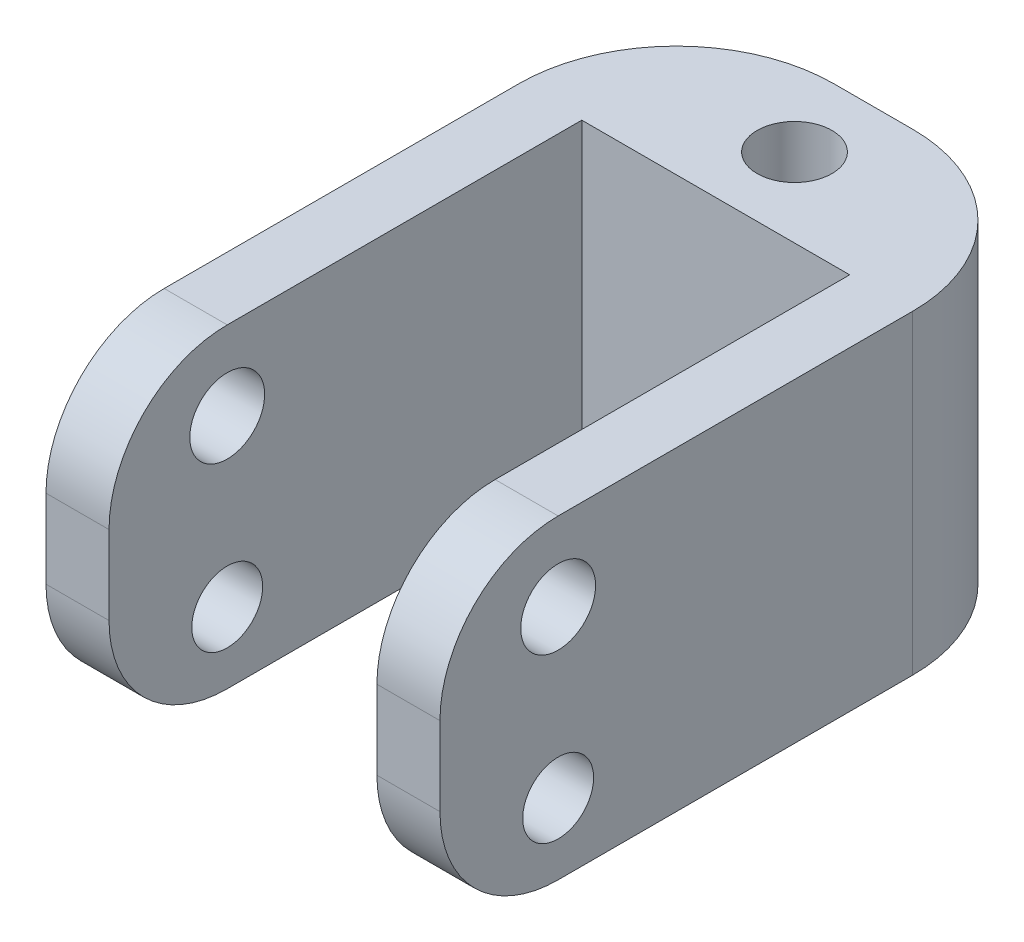
ISO-10303-21;
HEADER;
FILE_DESCRIPTION(('STEP AP214'),'2;1');
FILE_NAME('part.step','',(''),(''),'','','');
FILE_SCHEMA(('AUTOMOTIVE_DESIGN { 1 0 10303 214 1 1 1 1 }'));
ENDSEC;
DATA;
#1=APPLICATION_CONTEXT('core data for automotive mechanical design processes');
#2=APPLICATION_PROTOCOL_DEFINITION('international standard','automotive_design',2000,#1);
#3=PRODUCT_CONTEXT('',#1,'mechanical');
#4=PRODUCT('Part','Part','',(#3));
#5=PRODUCT_RELATED_PRODUCT_CATEGORY('part','',(#4));
#6=PRODUCT_DEFINITION_FORMATION('','',#4);
#7=PRODUCT_DEFINITION_CONTEXT('part definition',#1,'design');
#8=PRODUCT_DEFINITION('design','',#6,#7);
#9=PRODUCT_DEFINITION_SHAPE('','',#8);
#10=(LENGTH_UNIT() NAMED_UNIT(*) SI_UNIT(.MILLI.,.METRE.));
#11=(NAMED_UNIT(*) PLANE_ANGLE_UNIT() SI_UNIT($,.RADIAN.));
#12=(NAMED_UNIT(*) SI_UNIT($,.STERADIAN.) SOLID_ANGLE_UNIT());
#13=UNCERTAINTY_MEASURE_WITH_UNIT(LENGTH_MEASURE(1.E-05),#10,'distance_accuracy_value','');
#14=(GEOMETRIC_REPRESENTATION_CONTEXT(3) GLOBAL_UNCERTAINTY_ASSIGNED_CONTEXT((#13)) GLOBAL_UNIT_ASSIGNED_CONTEXT((#10,
#11,#12)) REPRESENTATION_CONTEXT('',''));
#15=CARTESIAN_POINT('',(0.,0.,0.));
#16=DIRECTION('',(0.,0.,1.));
#17=DIRECTION('',(1.,0.,0.));
#18=AXIS2_PLACEMENT_3D('',#15,#16,#17);
#19=CARTESIAN_POINT('',(25.,-20.,40.));
#20=DIRECTION('',(0.,0.,-1.));
#21=DIRECTION('',(-1.,0.,0.));
#22=AXIS2_PLACEMENT_3D('',#19,#20,#21);
#23=PLANE('',#22);
#24=DIRECTION('',(0.,1.,0.));
#25=VECTOR('',#24,1.);
#26=CARTESIAN_POINT('',(-17.,-20.,40.));
#27=LINE('',#26,#25);
#28=CARTESIAN_POINT('',(-17.,-5.00000000000001,40.));
#29=VERTEX_POINT('',#28);
#30=CARTESIAN_POINT('',(-17.,4.99999999999999,40.));
#31=VERTEX_POINT('',#30);
#32=EDGE_CURVE('E177',#29,#31,#27,.T.);
#33=ORIENTED_EDGE('',*,*,#32,.T.);
#34=DIRECTION('',(-1.,0.,0.));
#35=VECTOR('',#34,1.);
#36=CARTESIAN_POINT('',(25.,4.99999999999999,40.));
#37=LINE('',#36,#35);
#38=CARTESIAN_POINT('',(-25.,4.99999999999999,40.));
#39=VERTEX_POINT('',#38);
#40=EDGE_CURVE('E247',#31,#39,#37,.T.);
#41=ORIENTED_EDGE('',*,*,#40,.T.);
#42=DIRECTION('',(0.,-1.,0.));
#43=VECTOR('',#42,1.);
#44=CARTESIAN_POINT('',(-25.,-20.,40.));
#45=LINE('',#44,#43);
#46=CARTESIAN_POINT('',(-25.,-5.00000000000001,40.));
#47=VERTEX_POINT('',#46);
#48=EDGE_CURVE('E212',#39,#47,#45,.T.);
#49=ORIENTED_EDGE('',*,*,#48,.T.);
#50=DIRECTION('',(-1.,0.,0.));
#51=VECTOR('',#50,1.);
#52=CARTESIAN_POINT('',(25.,-5.00000000000001,40.));
#53=LINE('',#52,#51);
#54=EDGE_CURVE('E245',#47,#29,#53,.F.);
#55=ORIENTED_EDGE('',*,*,#54,.T.);
#56=EDGE_LOOP('',(#33,#41,#49,#55));
#57=FACE_BOUND('',#56,.T.);
#58=ADVANCED_FACE('F41',(#57),#23,.F.);
#59=CARTESIAN_POINT('',(25.,10.,25.));
#60=DIRECTION('',(-1.,0.,0.));
#61=DIRECTION('',(0.,0.,1.));
#62=AXIS2_PLACEMENT_3D('',#59,#60,#61);
#63=CYLINDRICAL_SURFACE('',#62,4.75);
#64=CARTESIAN_POINT('',(-17.,10.,25.));
#65=DIRECTION('',(-1.,0.,0.));
#66=DIRECTION('',(0.,0.,1.));
#67=AXIS2_PLACEMENT_3D('',#64,#65,#66);
#68=CIRCLE('',#67,4.75);
#69=CARTESIAN_POINT('',(-17.,10.,29.75));
#70=VERTEX_POINT('',#69);
#71=EDGE_CURVE('E187',#70,#70,#68,.T.);
#72=ORIENTED_EDGE('',*,*,#71,.F.);
#73=EDGE_LOOP('',(#72));
#74=FACE_BOUND('',#73,.T.);
#75=CARTESIAN_POINT('',(-25.,10.,25.));
#76=DIRECTION('',(1.,0.,0.));
#77=DIRECTION('',(0.,0.,-1.));
#78=AXIS2_PLACEMENT_3D('',#75,#76,#77);
#79=CIRCLE('',#78,4.75);
#80=CARTESIAN_POINT('',(-25.,10.,20.25));
#81=VERTEX_POINT('',#80);
#82=EDGE_CURVE('E194',#81,#81,#79,.T.);
#83=ORIENTED_EDGE('',*,*,#82,.F.);
#84=EDGE_LOOP('',(#83));
#85=FACE_BOUND('',#84,.T.);
#86=ADVANCED_FACE('F298',(#74,#85),#63,.F.);
#87=CARTESIAN_POINT('',(25.,-11.,25.));
#88=DIRECTION('',(-1.,0.,0.));
#89=DIRECTION('',(0.,0.,1.));
#90=AXIS2_PLACEMENT_3D('',#87,#88,#89);
#91=CYLINDRICAL_SURFACE('',#90,4.5);
#92=CARTESIAN_POINT('',(-17.,-11.,25.));
#93=DIRECTION('',(-1.,0.,0.));
#94=DIRECTION('',(0.,0.,1.));
#95=AXIS2_PLACEMENT_3D('',#92,#93,#94);
#96=CIRCLE('',#95,4.5);
#97=CARTESIAN_POINT('',(-17.,-11.,29.5));
#98=VERTEX_POINT('',#97);
#99=EDGE_CURVE('E186',#98,#98,#96,.T.);
#100=ORIENTED_EDGE('',*,*,#99,.F.);
#101=EDGE_LOOP('',(#100));
#102=FACE_BOUND('',#101,.T.);
#103=CARTESIAN_POINT('',(-25.,-11.,25.));
#104=DIRECTION('',(1.,0.,0.));
#105=DIRECTION('',(0.,0.,-1.));
#106=AXIS2_PLACEMENT_3D('',#103,#104,#105);
#107=CIRCLE('',#106,4.5);
#108=CARTESIAN_POINT('',(-25.,-11.,20.5));
#109=VERTEX_POINT('',#108);
#110=EDGE_CURVE('E190',#109,#109,#107,.T.);
#111=ORIENTED_EDGE('',*,*,#110,.F.);
#112=EDGE_LOOP('',(#111));
#113=FACE_BOUND('',#112,.T.);
#114=ADVANCED_FACE('F306',(#102,#113),#91,.F.);
#115=CARTESIAN_POINT('',(25.,0.,0.));
#116=DIRECTION('',(-1.,0.,0.));
#117=DIRECTION('',(0.,0.,1.));
#118=AXIS2_PLACEMENT_3D('',#115,#116,#117);
#119=PLANE('',#118);
#120=DIRECTION('',(0.,-1.,0.));
#121=VECTOR('',#120,1.);
#122=CARTESIAN_POINT('',(25.,-20.,40.));
#123=LINE('',#122,#121);
#124=CARTESIAN_POINT('',(25.,4.99999999999999,40.));
#125=VERTEX_POINT('',#124);
#126=CARTESIAN_POINT('',(25.,-5.00000000000001,40.));
#127=VERTEX_POINT('',#126);
#128=EDGE_CURVE('E205',#125,#127,#123,.T.);
#129=ORIENTED_EDGE('',*,*,#128,.T.);
#130=CARTESIAN_POINT('',(25.,-5.00000000000001,25.));
#131=DIRECTION('',(-1.,0.,0.));
#132=DIRECTION('',(0.,0.,1.));
#133=AXIS2_PLACEMENT_3D('',#130,#131,#132);
#134=CIRCLE('',#133,15.);
#135=CARTESIAN_POINT('',(25.,-20.,25.));
#136=VERTEX_POINT('',#135);
#137=EDGE_CURVE('E11',#127,#136,#134,.F.);
#138=ORIENTED_EDGE('',*,*,#137,.T.);
#139=DIRECTION('',(0.,0.,-1.));
#140=VECTOR('',#139,1.);
#141=CARTESIAN_POINT('',(25.,-20.,40.));
#142=LINE('',#141,#140);
#143=CARTESIAN_POINT('',(25.,-20.,-20.));
#144=VERTEX_POINT('',#143);
#145=EDGE_CURVE('E208',#136,#144,#142,.T.);
#146=ORIENTED_EDGE('',*,*,#145,.T.);
#147=DIRECTION('',(0.,1.,0.));
#148=VECTOR('',#147,1.);
#149=CARTESIAN_POINT('',(25.,0.,-20.));
#150=LINE('',#149,#148);
#151=CARTESIAN_POINT('',(25.,20.,-20.));
#152=VERTEX_POINT('',#151);
#153=EDGE_CURVE('E242',#144,#152,#150,.T.);
#154=ORIENTED_EDGE('',*,*,#153,.T.);
#155=DIRECTION('',(0.,0.,1.));
#156=VECTOR('',#155,1.);
#157=CARTESIAN_POINT('',(25.,20.,40.));
#158=LINE('',#157,#156);
#159=CARTESIAN_POINT('',(25.,20.,25.));
#160=VERTEX_POINT('',#159);
#161=EDGE_CURVE('E203',#152,#160,#158,.T.);
#162=ORIENTED_EDGE('',*,*,#161,.T.);
#163=CARTESIAN_POINT('',(25.,4.99999999999999,25.));
#164=DIRECTION('',(-1.,0.,0.));
#165=DIRECTION('',(0.,0.,1.));
#166=AXIS2_PLACEMENT_3D('',#163,#164,#165);
#167=CIRCLE('',#166,15.);
#168=EDGE_CURVE('E49',#160,#125,#167,.F.);
#169=ORIENTED_EDGE('',*,*,#168,.T.);
#170=EDGE_LOOP('',(#129,#138,#146,#154,#162,#169));
#171=FACE_BOUND('',#170,.T.);
#172=CARTESIAN_POINT('',(25.,10.,25.));
#173=DIRECTION('',(1.,0.,0.));
#174=DIRECTION('',(0.,0.,-1.));
#175=AXIS2_PLACEMENT_3D('',#172,#173,#174);
#176=CIRCLE('',#175,4.75);
#177=CARTESIAN_POINT('',(25.,10.,20.25));
#178=VERTEX_POINT('',#177);
#179=EDGE_CURVE('E197',#178,#178,#176,.T.);
#180=ORIENTED_EDGE('',*,*,#179,.F.);
#181=EDGE_LOOP('',(#180));
#182=FACE_BOUND('',#181,.T.);
#183=CARTESIAN_POINT('',(25.,-11.,25.));
#184=DIRECTION('',(1.,0.,0.));
#185=DIRECTION('',(0.,0.,-1.));
#186=AXIS2_PLACEMENT_3D('',#183,#184,#185);
#187=CIRCLE('',#186,4.5);
#188=CARTESIAN_POINT('',(25.,-11.,20.5));
#189=VERTEX_POINT('',#188);
#190=EDGE_CURVE('E191',#189,#189,#187,.T.);
#191=ORIENTED_EDGE('',*,*,#190,.F.);
#192=EDGE_LOOP('',(#191));
#193=FACE_BOUND('',#192,.T.);
#194=ADVANCED_FACE('F287',(#171,#182,#193),#119,.F.);
#195=CARTESIAN_POINT('',(-25.,0.,0.));
#196=DIRECTION('',(-1.,0.,0.));
#197=DIRECTION('',(0.,0.,1.));
#198=AXIS2_PLACEMENT_3D('',#195,#196,#197);
#199=PLANE('',#198);
#200=ORIENTED_EDGE('',*,*,#82,.T.);
#201=EDGE_LOOP('',(#200));
#202=FACE_BOUND('',#201,.T.);
#203=ORIENTED_EDGE('',*,*,#48,.F.);
#204=CARTESIAN_POINT('',(-25.,4.99999999999999,25.));
#205=DIRECTION('',(-1.,0.,0.));
#206=DIRECTION('',(0.,0.,1.));
#207=AXIS2_PLACEMENT_3D('',#204,#205,#206);
#208=CIRCLE('',#207,15.);
#209=CARTESIAN_POINT('',(-25.,20.,25.));
#210=VERTEX_POINT('',#209);
#211=EDGE_CURVE('E252',#39,#210,#208,.T.);
#212=ORIENTED_EDGE('',*,*,#211,.T.);
#213=DIRECTION('',(0.,0.,1.));
#214=VECTOR('',#213,1.);
#215=CARTESIAN_POINT('',(-25.,20.,40.));
#216=LINE('',#215,#214);
#217=CARTESIAN_POINT('',(-25.,20.,-20.));
#218=VERTEX_POINT('',#217);
#219=EDGE_CURVE('E200',#218,#210,#216,.T.);
#220=ORIENTED_EDGE('',*,*,#219,.F.);
#221=DIRECTION('',(0.,1.,0.));
#222=VECTOR('',#221,1.);
#223=CARTESIAN_POINT('',(-25.,-20.,-20.));
#224=LINE('',#223,#222);
#225=CARTESIAN_POINT('',(-25.,-20.,-20.));
#226=VERTEX_POINT('',#225);
#227=EDGE_CURVE('E234',#218,#226,#224,.F.);
#228=ORIENTED_EDGE('',*,*,#227,.T.);
#229=DIRECTION('',(0.,0.,-1.));
#230=VECTOR('',#229,1.);
#231=CARTESIAN_POINT('',(-25.,-20.,40.));
#232=LINE('',#231,#230);
#233=CARTESIAN_POINT('',(-25.,-20.,25.));
#234=VERTEX_POINT('',#233);
#235=EDGE_CURVE('E206',#234,#226,#232,.T.);
#236=ORIENTED_EDGE('',*,*,#235,.F.);
#237=CARTESIAN_POINT('',(-25.,-5.00000000000001,25.));
#238=DIRECTION('',(-1.,0.,0.));
#239=DIRECTION('',(0.,0.,1.));
#240=AXIS2_PLACEMENT_3D('',#237,#238,#239);
#241=CIRCLE('',#240,15.);
#242=EDGE_CURVE('E250',#234,#47,#241,.T.);
#243=ORIENTED_EDGE('',*,*,#242,.T.);
#244=EDGE_LOOP('',(#203,#212,#220,#228,#236,#243));
#245=FACE_BOUND('',#244,.T.);
#246=ORIENTED_EDGE('',*,*,#110,.T.);
#247=EDGE_LOOP('',(#246));
#248=FACE_BOUND('',#247,.T.);
#249=ADVANCED_FACE('F324',(#202,#245,#248),#199,.T.);
#250=CARTESIAN_POINT('',(25.,-20.,-40.));
#251=DIRECTION('',(0.,0.,1.));
#252=DIRECTION('',(1.,0.,0.));
#253=AXIS2_PLACEMENT_3D('',#250,#251,#252);
#254=PLANE('',#253);
#255=DIRECTION('',(-1.,0.,0.));
#256=VECTOR('',#255,1.);
#257=CARTESIAN_POINT('',(25.,-20.,-40.));
#258=LINE('',#257,#256);
#259=CARTESIAN_POINT('',(5.,-20.,-40.));
#260=VERTEX_POINT('',#259);
#261=CARTESIAN_POINT('',(-5.,-20.,-40.));
#262=VERTEX_POINT('',#261);
#263=EDGE_CURVE('E210',#260,#262,#258,.T.);
#264=ORIENTED_EDGE('',*,*,#263,.T.);
#265=DIRECTION('',(0.,1.,0.));
#266=VECTOR('',#265,1.);
#267=CARTESIAN_POINT('',(-5.,20.,-40.));
#268=LINE('',#267,#266);
#269=CARTESIAN_POINT('',(-5.,20.,-40.));
#270=VERTEX_POINT('',#269);
#271=EDGE_CURVE('E227',#262,#270,#268,.T.);
#272=ORIENTED_EDGE('',*,*,#271,.T.);
#273=DIRECTION('',(-1.,0.,0.));
#274=VECTOR('',#273,1.);
#275=CARTESIAN_POINT('',(25.,20.,-40.));
#276=LINE('',#275,#274);
#277=CARTESIAN_POINT('',(5.,20.,-40.));
#278=VERTEX_POINT('',#277);
#279=EDGE_CURVE('E218',#278,#270,#276,.T.);
#280=ORIENTED_EDGE('',*,*,#279,.F.);
#281=DIRECTION('',(0.,1.,0.));
#282=VECTOR('',#281,1.);
#283=CARTESIAN_POINT('',(5.,-20.,-40.));
#284=LINE('',#283,#282);
#285=EDGE_CURVE('E221',#278,#260,#284,.F.);
#286=ORIENTED_EDGE('',*,*,#285,.T.);
#287=EDGE_LOOP('',(#264,#272,#280,#286));
#288=FACE_BOUND('',#287,.T.);
#289=ADVANCED_FACE('F318',(#288),#254,.F.);
#290=CARTESIAN_POINT('',(25.,20.,40.));
#291=DIRECTION('',(0.,-1.,0.));
#292=DIRECTION('',(0.,0.,-1.));
#293=AXIS2_PLACEMENT_3D('',#290,#291,#292);
#294=PLANE('',#293);
#295=CARTESIAN_POINT('',(0.,20.,-30.));
#296=DIRECTION('',(0.,1.,0.));
#297=DIRECTION('',(0.,0.,1.));
#298=AXIS2_PLACEMENT_3D('',#295,#296,#297);
#299=CIRCLE('',#298,4.75);
#300=CARTESIAN_POINT('',(0.,20.,-25.25));
#301=VERTEX_POINT('',#300);
#302=EDGE_CURVE('E365',#301,#301,#299,.T.);
#303=ORIENTED_EDGE('',*,*,#302,.F.);
#304=EDGE_LOOP('',(#303));
#305=FACE_BOUND('',#304,.T.);
#306=ORIENTED_EDGE('',*,*,#219,.T.);
#307=DIRECTION('',(-1.,0.,0.));
#308=VECTOR('',#307,1.);
#309=CARTESIAN_POINT('',(25.,20.,25.));
#310=LINE('',#309,#308);
#311=CARTESIAN_POINT('',(-17.,20.,25.));
#312=VERTEX_POINT('',#311);
#313=EDGE_CURVE('E256',#210,#312,#310,.F.);
#314=ORIENTED_EDGE('',*,*,#313,.T.);
#315=DIRECTION('',(0.,0.,1.));
#316=VECTOR('',#315,1.);
#317=CARTESIAN_POINT('',(-17.,20.,40.));
#318=LINE('',#317,#316);
#319=CARTESIAN_POINT('',(-17.,20.,-20.));
#320=VERTEX_POINT('',#319);
#321=EDGE_CURVE('E153',#320,#312,#318,.T.);
#322=ORIENTED_EDGE('',*,*,#321,.F.);
#323=DIRECTION('',(-1.,0.,0.));
#324=VECTOR('',#323,1.);
#325=CARTESIAN_POINT('',(-17.,20.,-20.));
#326=LINE('',#325,#324);
#327=CARTESIAN_POINT('',(17.,20.,-20.));
#328=VERTEX_POINT('',#327);
#329=EDGE_CURVE('E152',#328,#320,#326,.T.);
#330=ORIENTED_EDGE('',*,*,#329,.F.);
#331=DIRECTION('',(0.,0.,-1.));
#332=VECTOR('',#331,1.);
#333=CARTESIAN_POINT('',(17.,20.,40.));
#334=LINE('',#333,#332);
#335=CARTESIAN_POINT('',(17.,20.,25.));
#336=VERTEX_POINT('',#335);
#337=EDGE_CURVE('E142',#336,#328,#334,.T.);
#338=ORIENTED_EDGE('',*,*,#337,.F.);
#339=DIRECTION('',(-1.,0.,0.));
#340=VECTOR('',#339,1.);
#341=CARTESIAN_POINT('',(25.,20.,25.));
#342=LINE('',#341,#340);
#343=EDGE_CURVE('E254',#336,#160,#342,.F.);
#344=ORIENTED_EDGE('',*,*,#343,.T.);
#345=ORIENTED_EDGE('',*,*,#161,.F.);
#346=CARTESIAN_POINT('',(5.,20.,-20.));
#347=DIRECTION('',(0.,-1.,0.));
#348=DIRECTION('',(0.,0.,-1.));
#349=AXIS2_PLACEMENT_3D('',#346,#347,#348);
#350=CIRCLE('',#349,20.);
#351=EDGE_CURVE('E230',#152,#278,#350,.F.);
#352=ORIENTED_EDGE('',*,*,#351,.T.);
#353=ORIENTED_EDGE('',*,*,#279,.T.);
#354=CARTESIAN_POINT('',(-5.,20.,-20.));
#355=DIRECTION('',(0.,-1.,0.));
#356=DIRECTION('',(0.,0.,-1.));
#357=AXIS2_PLACEMENT_3D('',#354,#355,#356);
#358=CIRCLE('',#357,20.);
#359=EDGE_CURVE('E232',#270,#218,#358,.F.);
#360=ORIENTED_EDGE('',*,*,#359,.T.);
#361=EDGE_LOOP('',(#306,#314,#322,#330,#338,#344,#345,#352,#353,#360));
#362=FACE_BOUND('',#361,.T.);
#363=ADVANCED_FACE('F166',(#305,#362),#294,.F.);
#364=DIRECTION('',(0.,1.,0.));
#365=VECTOR('',#364,1.);
#366=CARTESIAN_POINT('',(17.,-20.,40.));
#367=LINE('',#366,#365);
#368=CARTESIAN_POINT('',(17.,-5.00000000000001,40.));
#369=VERTEX_POINT('',#368);
#370=CARTESIAN_POINT('',(17.,4.99999999999999,40.));
#371=VERTEX_POINT('',#370);
#372=EDGE_CURVE('E163',#369,#371,#367,.T.);
#373=ORIENTED_EDGE('',*,*,#372,.F.);
#374=DIRECTION('',(-1.,0.,0.));
#375=VECTOR('',#374,1.);
#376=CARTESIAN_POINT('',(25.,-5.00000000000001,40.));
#377=LINE('',#376,#375);
#378=EDGE_CURVE('E56',#369,#127,#377,.F.);
#379=ORIENTED_EDGE('',*,*,#378,.T.);
#380=ORIENTED_EDGE('',*,*,#128,.F.);
#381=DIRECTION('',(-1.,0.,0.));
#382=VECTOR('',#381,1.);
#383=CARTESIAN_POINT('',(25.,4.99999999999999,40.));
#384=LINE('',#383,#382);
#385=EDGE_CURVE('E271',#125,#371,#384,.T.);
#386=ORIENTED_EDGE('',*,*,#385,.T.);
#387=EDGE_LOOP('',(#373,#379,#380,#386));
#388=FACE_BOUND('',#387,.T.);
#389=ADVANCED_FACE('F275',(#388),#23,.F.);
#390=CARTESIAN_POINT('',(25.,-20.,40.));
#391=DIRECTION('',(0.,1.,0.));
#392=DIRECTION('',(0.,0.,1.));
#393=AXIS2_PLACEMENT_3D('',#390,#391,#392);
#394=PLANE('',#393);
#395=CARTESIAN_POINT('',(0.,-20.,-30.));
#396=DIRECTION('',(0.,1.,0.));
#397=DIRECTION('',(0.,0.,1.));
#398=AXIS2_PLACEMENT_3D('',#395,#396,#397);
#399=CIRCLE('',#398,4.75);
#400=CARTESIAN_POINT('',(0.,-20.,-25.25));
#401=VERTEX_POINT('',#400);
#402=EDGE_CURVE('E363',#401,#401,#399,.T.);
#403=ORIENTED_EDGE('',*,*,#402,.T.);
#404=EDGE_LOOP('',(#403));
#405=FACE_BOUND('',#404,.T.);
#406=DIRECTION('',(0.,0.,1.));
#407=VECTOR('',#406,1.);
#408=CARTESIAN_POINT('',(-17.,-20.,40.));
#409=LINE('',#408,#407);
#410=CARTESIAN_POINT('',(-17.,-20.,-20.));
#411=VERTEX_POINT('',#410);
#412=CARTESIAN_POINT('',(-17.,-20.,25.));
#413=VERTEX_POINT('',#412);
#414=EDGE_CURVE('E168',#411,#413,#409,.T.);
#415=ORIENTED_EDGE('',*,*,#414,.T.);
#416=DIRECTION('',(-1.,0.,0.));
#417=VECTOR('',#416,1.);
#418=CARTESIAN_POINT('',(25.,-20.,25.));
#419=LINE('',#418,#417);
#420=EDGE_CURVE('E265',#413,#234,#419,.T.);
#421=ORIENTED_EDGE('',*,*,#420,.T.);
#422=ORIENTED_EDGE('',*,*,#235,.T.);
#423=CARTESIAN_POINT('',(-5.,-20.,-20.));
#424=DIRECTION('',(0.,1.,0.));
#425=DIRECTION('',(0.,0.,1.));
#426=AXIS2_PLACEMENT_3D('',#423,#424,#425);
#427=CIRCLE('',#426,20.);
#428=EDGE_CURVE('E240',#226,#262,#427,.F.);
#429=ORIENTED_EDGE('',*,*,#428,.T.);
#430=ORIENTED_EDGE('',*,*,#263,.F.);
#431=CARTESIAN_POINT('',(5.,-20.,-20.));
#432=DIRECTION('',(0.,1.,0.));
#433=DIRECTION('',(0.,0.,1.));
#434=AXIS2_PLACEMENT_3D('',#431,#432,#433);
#435=CIRCLE('',#434,20.);
#436=EDGE_CURVE('E237',#260,#144,#435,.F.);
#437=ORIENTED_EDGE('',*,*,#436,.T.);
#438=ORIENTED_EDGE('',*,*,#145,.F.);
#439=DIRECTION('',(-1.,0.,0.));
#440=VECTOR('',#439,1.);
#441=CARTESIAN_POINT('',(25.,-20.,25.));
#442=LINE('',#441,#440);
#443=CARTESIAN_POINT('',(17.,-20.,25.));
#444=VERTEX_POINT('',#443);
#445=EDGE_CURVE('E262',#136,#444,#442,.T.);
#446=ORIENTED_EDGE('',*,*,#445,.T.);
#447=DIRECTION('',(0.,0.,-1.));
#448=VECTOR('',#447,1.);
#449=CARTESIAN_POINT('',(17.,-20.,40.));
#450=LINE('',#449,#448);
#451=CARTESIAN_POINT('',(17.,-20.,-20.));
#452=VERTEX_POINT('',#451);
#453=EDGE_CURVE('E171',#444,#452,#450,.T.);
#454=ORIENTED_EDGE('',*,*,#453,.T.);
#455=DIRECTION('',(-1.,0.,0.));
#456=VECTOR('',#455,1.);
#457=CARTESIAN_POINT('',(-17.,-20.,-20.));
#458=LINE('',#457,#456);
#459=EDGE_CURVE('E161',#452,#411,#458,.T.);
#460=ORIENTED_EDGE('',*,*,#459,.T.);
#461=EDGE_LOOP('',(#415,#421,#422,#429,#430,#437,#438,#446,#454,#460));
#462=FACE_BOUND('',#461,.T.);
#463=ADVANCED_FACE('F283',(#405,#462),#394,.F.);
#464=CARTESIAN_POINT('',(17.,10.,25.));
#465=DIRECTION('',(1.,0.,0.));
#466=DIRECTION('',(0.,0.,-1.));
#467=AXIS2_PLACEMENT_3D('',#464,#465,#466);
#468=CIRCLE('',#467,4.75);
#469=CARTESIAN_POINT('',(17.,10.,20.25));
#470=VERTEX_POINT('',#469);
#471=EDGE_CURVE('E183',#470,#470,#468,.T.);
#472=ORIENTED_EDGE('',*,*,#471,.F.);
#473=EDGE_LOOP('',(#472));
#474=FACE_BOUND('',#473,.T.);
#475=ORIENTED_EDGE('',*,*,#179,.T.);
#476=EDGE_LOOP('',(#475));
#477=FACE_BOUND('',#476,.T.);
#478=ADVANCED_FACE('F309',(#474,#477),#63,.F.);
#479=CARTESIAN_POINT('',(17.,-11.,25.));
#480=DIRECTION('',(1.,0.,0.));
#481=DIRECTION('',(0.,0.,-1.));
#482=AXIS2_PLACEMENT_3D('',#479,#480,#481);
#483=CIRCLE('',#482,4.5);
#484=CARTESIAN_POINT('',(17.,-11.,20.5));
#485=VERTEX_POINT('',#484);
#486=EDGE_CURVE('E178',#485,#485,#483,.T.);
#487=ORIENTED_EDGE('',*,*,#486,.F.);
#488=EDGE_LOOP('',(#487));
#489=FACE_BOUND('',#488,.T.);
#490=ORIENTED_EDGE('',*,*,#190,.T.);
#491=EDGE_LOOP('',(#490));
#492=FACE_BOUND('',#491,.T.);
#493=ADVANCED_FACE('F384',(#489,#492),#91,.F.);
#494=CARTESIAN_POINT('',(-17.,-20.,40.));
#495=DIRECTION('',(-1.,0.,0.));
#496=DIRECTION('',(0.,0.,1.));
#497=AXIS2_PLACEMENT_3D('',#494,#495,#496);
#498=PLANE('',#497);
#499=ORIENTED_EDGE('',*,*,#71,.T.);
#500=EDGE_LOOP('',(#499));
#501=FACE_BOUND('',#500,.T.);
#502=ORIENTED_EDGE('',*,*,#99,.T.);
#503=EDGE_LOOP('',(#502));
#504=FACE_BOUND('',#503,.T.);
#505=ORIENTED_EDGE('',*,*,#321,.T.);
#506=CARTESIAN_POINT('',(-17.,4.99999999999999,25.));
#507=DIRECTION('',(-1.,0.,0.));
#508=DIRECTION('',(0.,0.,1.));
#509=AXIS2_PLACEMENT_3D('',#506,#507,#508);
#510=CIRCLE('',#509,15.);
#511=EDGE_CURVE('E260',#312,#31,#510,.F.);
#512=ORIENTED_EDGE('',*,*,#511,.T.);
#513=ORIENTED_EDGE('',*,*,#32,.F.);
#514=CARTESIAN_POINT('',(-17.,-5.00000000000001,25.));
#515=DIRECTION('',(-1.,0.,0.));
#516=DIRECTION('',(0.,0.,1.));
#517=AXIS2_PLACEMENT_3D('',#514,#515,#516);
#518=CIRCLE('',#517,15.);
#519=EDGE_CURVE('E258',#29,#413,#518,.F.);
#520=ORIENTED_EDGE('',*,*,#519,.T.);
#521=ORIENTED_EDGE('',*,*,#414,.F.);
#522=DIRECTION('',(0.,1.,0.));
#523=VECTOR('',#522,1.);
#524=CARTESIAN_POINT('',(-17.,-20.,-20.));
#525=LINE('',#524,#523);
#526=EDGE_CURVE('E162',#411,#320,#525,.T.);
#527=ORIENTED_EDGE('',*,*,#526,.T.);
#528=EDGE_LOOP('',(#505,#512,#513,#520,#521,#527));
#529=FACE_BOUND('',#528,.T.);
#530=ADVANCED_FACE('F350',(#501,#504,#529),#498,.F.);
#531=CARTESIAN_POINT('',(-17.,-20.,-20.));
#532=DIRECTION('',(0.,0.,-1.));
#533=DIRECTION('',(-1.,0.,0.));
#534=AXIS2_PLACEMENT_3D('',#531,#532,#533);
#535=PLANE('',#534);
#536=ORIENTED_EDGE('',*,*,#526,.F.);
#537=ORIENTED_EDGE('',*,*,#459,.F.);
#538=DIRECTION('',(0.,1.,0.));
#539=VECTOR('',#538,1.);
#540=CARTESIAN_POINT('',(17.,-20.,-20.));
#541=LINE('',#540,#539);
#542=EDGE_CURVE('E146',#452,#328,#541,.T.);
#543=ORIENTED_EDGE('',*,*,#542,.T.);
#544=ORIENTED_EDGE('',*,*,#329,.T.);
#545=EDGE_LOOP('',(#536,#537,#543,#544));
#546=FACE_BOUND('',#545,.T.);
#547=ADVANCED_FACE('F158',(#546),#535,.F.);
#548=CARTESIAN_POINT('',(17.,-20.,40.));
#549=DIRECTION('',(1.,0.,0.));
#550=DIRECTION('',(0.,0.,-1.));
#551=AXIS2_PLACEMENT_3D('',#548,#549,#550);
#552=PLANE('',#551);
#553=ORIENTED_EDGE('',*,*,#471,.T.);
#554=EDGE_LOOP('',(#553));
#555=FACE_BOUND('',#554,.T.);
#556=ORIENTED_EDGE('',*,*,#486,.T.);
#557=EDGE_LOOP('',(#556));
#558=FACE_BOUND('',#557,.T.);
#559=ORIENTED_EDGE('',*,*,#453,.F.);
#560=CARTESIAN_POINT('',(17.,-5.00000000000001,25.));
#561=DIRECTION('',(1.,0.,0.));
#562=DIRECTION('',(0.,0.,-1.));
#563=AXIS2_PLACEMENT_3D('',#560,#561,#562);
#564=CIRCLE('',#563,15.);
#565=EDGE_CURVE('E269',#444,#369,#564,.F.);
#566=ORIENTED_EDGE('',*,*,#565,.T.);
#567=ORIENTED_EDGE('',*,*,#372,.T.);
#568=CARTESIAN_POINT('',(17.,4.99999999999999,25.));
#569=DIRECTION('',(1.,0.,0.));
#570=DIRECTION('',(0.,0.,-1.));
#571=AXIS2_PLACEMENT_3D('',#568,#569,#570);
#572=CIRCLE('',#571,15.);
#573=EDGE_CURVE('E148',#371,#336,#572,.F.);
#574=ORIENTED_EDGE('',*,*,#573,.T.);
#575=ORIENTED_EDGE('',*,*,#337,.T.);
#576=ORIENTED_EDGE('',*,*,#542,.F.);
#577=EDGE_LOOP('',(#559,#566,#567,#574,#575,#576));
#578=FACE_BOUND('',#577,.T.);
#579=ADVANCED_FACE('F145',(#555,#558,#578),#552,.F.);
#580=CARTESIAN_POINT('',(0.,-20.,-30.));
#581=DIRECTION('',(0.,1.,0.));
#582=DIRECTION('',(0.,0.,1.));
#583=AXIS2_PLACEMENT_3D('',#580,#581,#582);
#584=CYLINDRICAL_SURFACE('',#583,4.75);
#585=CARTESIAN_POINT('',(0.,-20.,-25.25));
#586=CARTESIAN_POINT('',(0.,-19.5833333333333,-25.25));
#587=CARTESIAN_POINT('',(0.,-19.1666666666667,-25.25));
#588=CARTESIAN_POINT('',(0.,-18.3333333333333,-25.25));
#589=CARTESIAN_POINT('',(0.,-17.9166666666667,-25.25));
#590=CARTESIAN_POINT('',(0.,-17.0833333333333,-25.25));
#591=CARTESIAN_POINT('',(0.,-16.6666666666667,-25.25));
#592=CARTESIAN_POINT('',(0.,-15.8333333333333,-25.25));
#593=CARTESIAN_POINT('',(0.,-15.4166666666667,-25.25));
#594=CARTESIAN_POINT('',(0.,-14.5833333333333,-25.25));
#595=CARTESIAN_POINT('',(0.,-14.1666666666667,-25.25));
#596=CARTESIAN_POINT('',(0.,-13.3333333333333,-25.25));
#597=CARTESIAN_POINT('',(0.,-12.9166666666667,-25.25));
#598=CARTESIAN_POINT('',(0.,-12.0833333333333,-25.25));
#599=CARTESIAN_POINT('',(0.,-11.6666666666667,-25.25));
#600=CARTESIAN_POINT('',(0.,-10.8333333333333,-25.25));
#601=CARTESIAN_POINT('',(0.,-10.4166666666667,-25.25));
#602=CARTESIAN_POINT('',(0.,-9.58333333333334,-25.25));
#603=CARTESIAN_POINT('',(0.,-9.16666666666667,-25.25));
#604=CARTESIAN_POINT('',(0.,-8.33333333333334,-25.25));
#605=CARTESIAN_POINT('',(0.,-7.91666666666667,-25.25));
#606=CARTESIAN_POINT('',(0.,-7.08333333333334,-25.25));
#607=CARTESIAN_POINT('',(0.,-6.66666666666668,-25.25));
#608=CARTESIAN_POINT('',(0.,-5.83333333333334,-25.25));
#609=CARTESIAN_POINT('',(0.,-5.41666666666667,-25.25));
#610=CARTESIAN_POINT('',(0.,-4.58333333333334,-25.25));
#611=CARTESIAN_POINT('',(0.,-4.16666666666667,-25.25));
#612=CARTESIAN_POINT('',(0.,-3.33333333333334,-25.25));
#613=CARTESIAN_POINT('',(0.,-2.91666666666667,-25.25));
#614=CARTESIAN_POINT('',(0.,-2.08333333333334,-25.25));
#615=CARTESIAN_POINT('',(0.,-1.66666666666667,-25.25));
#616=CARTESIAN_POINT('',(0.,-0.833333333333341,-25.25));
#617=CARTESIAN_POINT('',(0.,-0.416666666666674,-25.25));
#618=CARTESIAN_POINT('',(0.,0.41666666666666,-25.25));
#619=CARTESIAN_POINT('',(0.,0.833333333333327,-25.25));
#620=CARTESIAN_POINT('',(0.,1.66666666666666,-25.25));
#621=CARTESIAN_POINT('',(0.,2.08333333333333,-25.25));
#622=CARTESIAN_POINT('',(0.,2.91666666666666,-25.25));
#623=CARTESIAN_POINT('',(0.,3.33333333333333,-25.25));
#624=CARTESIAN_POINT('',(0.,4.16666666666666,-25.25));
#625=CARTESIAN_POINT('',(0.,4.58333333333333,-25.25));
#626=CARTESIAN_POINT('',(0.,5.41666666666666,-25.25));
#627=CARTESIAN_POINT('',(0.,5.83333333333333,-25.25));
#628=CARTESIAN_POINT('',(0.,6.66666666666666,-25.25));
#629=CARTESIAN_POINT('',(0.,7.08333333333333,-25.25));
#630=CARTESIAN_POINT('',(0.,7.91666666666666,-25.25));
#631=CARTESIAN_POINT('',(0.,8.33333333333333,-25.25));
#632=CARTESIAN_POINT('',(0.,9.16666666666666,-25.25));
#633=CARTESIAN_POINT('',(0.,9.58333333333333,-25.25));
#634=CARTESIAN_POINT('',(0.,10.4166666666667,-25.25));
#635=CARTESIAN_POINT('',(0.,10.8333333333333,-25.25));
#636=CARTESIAN_POINT('',(0.,11.6666666666667,-25.25));
#637=CARTESIAN_POINT('',(0.,12.0833333333333,-25.25));
#638=CARTESIAN_POINT('',(0.,12.9166666666667,-25.25));
#639=CARTESIAN_POINT('',(0.,13.3333333333333,-25.25));
#640=CARTESIAN_POINT('',(0.,14.1666666666667,-25.25));
#641=CARTESIAN_POINT('',(0.,14.5833333333333,-25.25));
#642=CARTESIAN_POINT('',(0.,15.4166666666667,-25.25));
#643=CARTESIAN_POINT('',(0.,15.8333333333333,-25.25));
#644=CARTESIAN_POINT('',(0.,16.6666666666667,-25.25));
#645=CARTESIAN_POINT('',(0.,17.0833333333333,-25.25));
#646=CARTESIAN_POINT('',(0.,17.9166666666667,-25.25));
#647=CARTESIAN_POINT('',(0.,18.3333333333333,-25.25));
#648=CARTESIAN_POINT('',(0.,19.1666666666667,-25.25));
#649=CARTESIAN_POINT('',(0.,19.5833333333333,-25.25));
#650=CARTESIAN_POINT('',(0.,20.,-25.25));
#651=B_SPLINE_CURVE_WITH_KNOTS('',3,(#585,#586,#587,#588,#589,#590,#591,#592,#593,#594,#595,
#596,#597,#598,#599,#600,#601,#602,#603,#604,#605,#606,#607,#608,#609,#610,#611,#612,#613,#614,
#615,#616,#617,#618,#619,#620,#621,#622,#623,#624,#625,#626,#627,#628,#629,#630,#631,#632,#633,
#634,#635,#636,#637,#638,#639,#640,#641,#642,#643,#644,#645,#646,#647,#648,#649,#650),
.UNSPECIFIED.,.F.,.F.,(4,2,2,2,2,2,2,2,2,2,2,2,2,2,2,2,2,2,2,2,2,2,2,2,2,2,2,2,2,2,2,2,4),(0.,
1.25,2.5,3.75,5.,6.25,7.5,8.75,10.,11.25,12.5,13.75,15.,16.25,17.5,18.75,20.,21.25,22.5,23.75,
25.,26.25,27.5,28.75,30.,31.25,32.5,33.75,35.,36.25,37.5,38.75,40.),.UNSPECIFIED.);
#652=EDGE_CURVE('BSEAM333',#401,#301,#651,.T.);
#653=ORIENTED_EDGE('',*,*,#402,.F.);
#654=ORIENTED_EDGE('',*,*,#302,.T.);
#655=ORIENTED_EDGE('',*,*,#652,.T.);
#656=ORIENTED_EDGE('',*,*,#652,.F.);
#657=EDGE_LOOP('',(#653,#655,#654,#656));
#658=FACE_BOUND('',#657,.T.);
#659=ADVANCED_FACE('F333',(#658),#584,.F.);
#660=CARTESIAN_POINT('',(-5.,-20.,-20.));
#661=DIRECTION('',(0.,-1.,0.));
#662=DIRECTION('',(0.,0.,-1.));
#663=AXIS2_PLACEMENT_3D('',#660,#661,#662);
#664=CYLINDRICAL_SURFACE('',#663,20.);
#665=ORIENTED_EDGE('',*,*,#428,.F.);
#666=ORIENTED_EDGE('',*,*,#227,.F.);
#667=ORIENTED_EDGE('',*,*,#359,.F.);
#668=ORIENTED_EDGE('',*,*,#271,.F.);
#669=EDGE_LOOP('',(#665,#666,#667,#668));
#670=FACE_BOUND('',#669,.T.);
#671=ADVANCED_FACE('F329',(#670),#664,.T.);
#672=CARTESIAN_POINT('',(5.,0.,-20.));
#673=DIRECTION('',(0.,1.,0.));
#674=DIRECTION('',(0.,0.,1.));
#675=AXIS2_PLACEMENT_3D('',#672,#673,#674);
#676=CYLINDRICAL_SURFACE('',#675,20.);
#677=ORIENTED_EDGE('',*,*,#436,.F.);
#678=ORIENTED_EDGE('',*,*,#285,.F.);
#679=ORIENTED_EDGE('',*,*,#351,.F.);
#680=ORIENTED_EDGE('',*,*,#153,.F.);
#681=EDGE_LOOP('',(#677,#678,#679,#680));
#682=FACE_BOUND('',#681,.T.);
#683=ADVANCED_FACE('F332',(#682),#676,.T.);
#684=CARTESIAN_POINT('',(25.,4.99999999999999,25.));
#685=DIRECTION('',(-1.,0.,0.));
#686=DIRECTION('',(0.,0.,1.));
#687=AXIS2_PLACEMENT_3D('',#684,#685,#686);
#688=CYLINDRICAL_SURFACE('',#687,15.);
#689=ORIENTED_EDGE('',*,*,#511,.F.);
#690=ORIENTED_EDGE('',*,*,#313,.F.);
#691=ORIENTED_EDGE('',*,*,#211,.F.);
#692=ORIENTED_EDGE('',*,*,#40,.F.);
#693=EDGE_LOOP('',(#689,#690,#691,#692));
#694=FACE_BOUND('',#693,.T.);
#695=ADVANCED_FACE('F336',(#694),#688,.T.);
#696=CARTESIAN_POINT('',(25.,-5.00000000000001,25.));
#697=DIRECTION('',(-1.,0.,0.));
#698=DIRECTION('',(0.,0.,1.));
#699=AXIS2_PLACEMENT_3D('',#696,#697,#698);
#700=CYLINDRICAL_SURFACE('',#699,15.);
#701=ORIENTED_EDGE('',*,*,#519,.F.);
#702=ORIENTED_EDGE('',*,*,#54,.F.);
#703=ORIENTED_EDGE('',*,*,#242,.F.);
#704=ORIENTED_EDGE('',*,*,#420,.F.);
#705=EDGE_LOOP('',(#701,#702,#703,#704));
#706=FACE_BOUND('',#705,.T.);
#707=ADVANCED_FACE('F296',(#706),#700,.T.);
#708=CARTESIAN_POINT('',(25.,-5.00000000000001,25.));
#709=DIRECTION('',(-1.,0.,0.));
#710=DIRECTION('',(0.,0.,1.));
#711=AXIS2_PLACEMENT_3D('',#708,#709,#710);
#712=CYLINDRICAL_SURFACE('',#711,15.);
#713=ORIENTED_EDGE('',*,*,#137,.F.);
#714=ORIENTED_EDGE('',*,*,#378,.F.);
#715=ORIENTED_EDGE('',*,*,#565,.F.);
#716=ORIENTED_EDGE('',*,*,#445,.F.);
#717=EDGE_LOOP('',(#713,#714,#715,#716));
#718=FACE_BOUND('',#717,.T.);
#719=ADVANCED_FACE('F280',(#718),#712,.T.);
#720=CARTESIAN_POINT('',(25.,4.99999999999999,25.));
#721=DIRECTION('',(-1.,0.,0.));
#722=DIRECTION('',(0.,0.,1.));
#723=AXIS2_PLACEMENT_3D('',#720,#721,#722);
#724=CYLINDRICAL_SURFACE('',#723,15.);
#725=ORIENTED_EDGE('',*,*,#168,.F.);
#726=ORIENTED_EDGE('',*,*,#343,.F.);
#727=ORIENTED_EDGE('',*,*,#573,.F.);
#728=ORIENTED_EDGE('',*,*,#385,.F.);
#729=EDGE_LOOP('',(#725,#726,#727,#728));
#730=FACE_BOUND('',#729,.T.);
#731=ADVANCED_FACE('F43',(#730),#724,.T.);
#732=CLOSED_SHELL('',(#58,#86,#114,#194,#249,#289,#363,#389,#463,#478,#493,#530,#547,#579,#659,
#671,#683,#695,#707,#719,#731));
#733=MANIFOLD_SOLID_BREP('B2',#732);
#734=ADVANCED_BREP_SHAPE_REPRESENTATION('',(#18,#733),#14);
#735=SHAPE_DEFINITION_REPRESENTATION(#9,#734);
ENDSEC;
END-ISO-10303-21;
